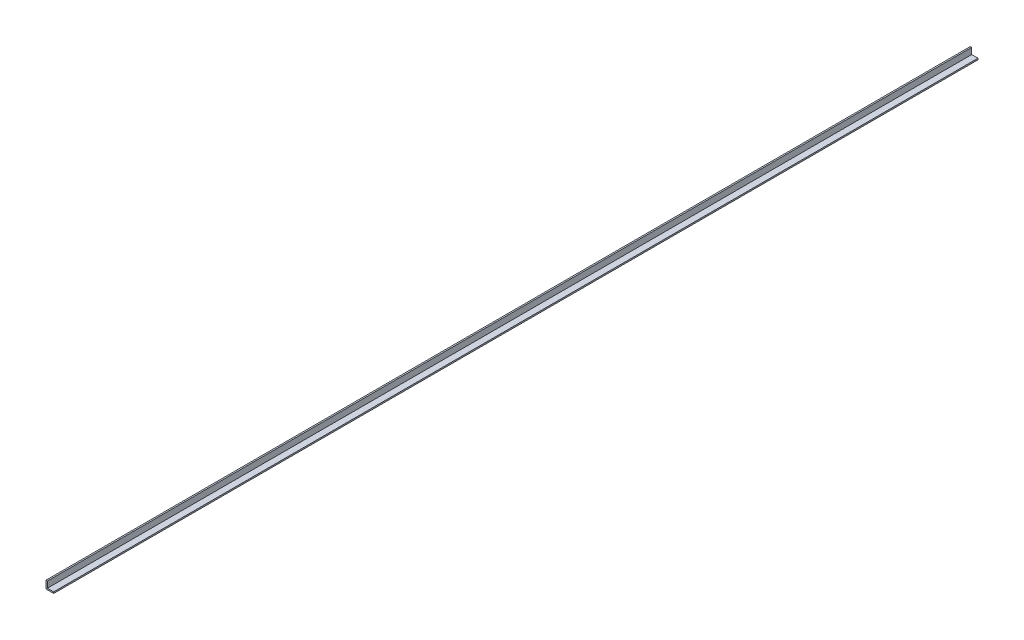
ISO-10303-21;
HEADER;
FILE_DESCRIPTION(('STEP AP214'),'2;1');
FILE_NAME('part.step','',(''),(''),'','','');
FILE_SCHEMA(('AUTOMOTIVE_DESIGN { 1 0 10303 214 1 1 1 1 }'));
ENDSEC;
DATA;
#1=APPLICATION_CONTEXT('core data for automotive mechanical design processes');
#2=APPLICATION_PROTOCOL_DEFINITION('international standard','automotive_design',2000,#1);
#3=PRODUCT_CONTEXT('',#1,'mechanical');
#4=PRODUCT('Part','Part','',(#3));
#5=PRODUCT_RELATED_PRODUCT_CATEGORY('part','',(#4));
#6=PRODUCT_DEFINITION_FORMATION('','',#4);
#7=PRODUCT_DEFINITION_CONTEXT('part definition',#1,'design');
#8=PRODUCT_DEFINITION('design','',#6,#7);
#9=PRODUCT_DEFINITION_SHAPE('','',#8);
#10=(LENGTH_UNIT() NAMED_UNIT(*) SI_UNIT(.MILLI.,.METRE.));
#11=(NAMED_UNIT(*) PLANE_ANGLE_UNIT() SI_UNIT($,.RADIAN.));
#12=(NAMED_UNIT(*) SI_UNIT($,.STERADIAN.) SOLID_ANGLE_UNIT());
#13=UNCERTAINTY_MEASURE_WITH_UNIT(LENGTH_MEASURE(1.E-05),#10,'distance_accuracy_value','');
#14=(GEOMETRIC_REPRESENTATION_CONTEXT(3) GLOBAL_UNCERTAINTY_ASSIGNED_CONTEXT((#13)) GLOBAL_UNIT_ASSIGNED_CONTEXT((#10,
#11,#12)) REPRESENTATION_CONTEXT('',''));
#15=CARTESIAN_POINT('',(0.,0.,0.));
#16=DIRECTION('',(0.,0.,1.));
#17=DIRECTION('',(1.,0.,0.));
#18=AXIS2_PLACEMENT_3D('',#15,#16,#17);
#19=CARTESIAN_POINT('',(9.53000000000001,50.8,-6100.));
#20=DIRECTION('',(0.,1.,0.));
#21=DIRECTION('',(0.,0.,1.));
#22=AXIS2_PLACEMENT_3D('',#19,#20,#21);
#23=PLANE('',#22);
#24=DIRECTION('',(-1.,0.,0.));
#25=VECTOR('',#24,1.);
#26=CARTESIAN_POINT('',(9.53000000000001,50.8,0.));
#27=LINE('',#26,#25);
#28=CARTESIAN_POINT('',(9.53000000000001,50.8,0.));
#29=VERTEX_POINT('',#28);
#30=CARTESIAN_POINT('',(0.,50.8,0.));
#31=VERTEX_POINT('',#30);
#32=EDGE_CURVE('E118',#29,#31,#27,.T.);
#33=ORIENTED_EDGE('',*,*,#32,.F.);
#34=DIRECTION('',(0.,0.,1.));
#35=VECTOR('',#34,1.);
#36=CARTESIAN_POINT('',(9.53000000000001,50.8,-6100.));
#37=LINE('',#36,#35);
#38=CARTESIAN_POINT('',(9.53000000000001,50.8,-6100.));
#39=VERTEX_POINT('',#38);
#40=EDGE_CURVE('E11',#39,#29,#37,.T.);
#41=ORIENTED_EDGE('',*,*,#40,.F.);
#42=DIRECTION('',(-1.,0.,0.));
#43=VECTOR('',#42,1.);
#44=CARTESIAN_POINT('',(9.53000000000001,50.8,-6100.));
#45=LINE('',#44,#43);
#46=CARTESIAN_POINT('',(0.,50.8,-6100.));
#47=VERTEX_POINT('',#46);
#48=EDGE_CURVE('E132',#39,#47,#45,.T.);
#49=ORIENTED_EDGE('',*,*,#48,.T.);
#50=DIRECTION('',(0.,0.,1.));
#51=VECTOR('',#50,1.);
#52=CARTESIAN_POINT('',(0.,50.8,-6100.));
#53=LINE('',#52,#51);
#54=EDGE_CURVE('E36',#47,#31,#53,.T.);
#55=ORIENTED_EDGE('',*,*,#54,.T.);
#56=EDGE_LOOP('',(#33,#41,#49,#55));
#57=FACE_BOUND('',#56,.T.);
#58=ADVANCED_FACE('F33',(#57),#23,.T.);
#59=CARTESIAN_POINT('',(9.53,9.52999999999999,-6100.));
#60=DIRECTION('',(1.,0.,0.));
#61=DIRECTION('',(0.,1.,0.));
#62=AXIS2_PLACEMENT_3D('',#59,#60,#61);
#63=PLANE('',#62);
#64=DIRECTION('',(0.,1.,0.));
#65=VECTOR('',#64,1.);
#66=CARTESIAN_POINT('',(9.53,9.52999999999999,0.));
#67=LINE('',#66,#65);
#68=CARTESIAN_POINT('',(9.53,9.52999999999999,0.));
#69=VERTEX_POINT('',#68);
#70=EDGE_CURVE('E130',#69,#29,#67,.T.);
#71=ORIENTED_EDGE('',*,*,#70,.F.);
#72=DIRECTION('',(0.,0.,1.));
#73=VECTOR('',#72,1.);
#74=CARTESIAN_POINT('',(9.53,9.52999999999999,-6100.));
#75=LINE('',#74,#73);
#76=CARTESIAN_POINT('',(9.53,9.52999999999999,-6100.));
#77=VERTEX_POINT('',#76);
#78=EDGE_CURVE('E42',#77,#69,#75,.T.);
#79=ORIENTED_EDGE('',*,*,#78,.F.);
#80=DIRECTION('',(0.,1.,0.));
#81=VECTOR('',#80,1.);
#82=CARTESIAN_POINT('',(9.53,9.52999999999999,-6100.));
#83=LINE('',#82,#81);
#84=EDGE_CURVE('E108',#77,#39,#83,.T.);
#85=ORIENTED_EDGE('',*,*,#84,.T.);
#86=ORIENTED_EDGE('',*,*,#40,.T.);
#87=EDGE_LOOP('',(#71,#79,#85,#86));
#88=FACE_BOUND('',#87,.T.);
#89=ADVANCED_FACE('F140',(#88),#63,.T.);
#90=CARTESIAN_POINT('',(50.8,9.53,-6100.));
#91=DIRECTION('',(0.,1.,0.));
#92=DIRECTION('',(-1.,0.,0.));
#93=AXIS2_PLACEMENT_3D('',#90,#91,#92);
#94=PLANE('',#93);
#95=DIRECTION('',(-1.,0.,0.));
#96=VECTOR('',#95,1.);
#97=CARTESIAN_POINT('',(50.8,9.53,0.));
#98=LINE('',#97,#96);
#99=CARTESIAN_POINT('',(50.8,9.53,0.));
#100=VERTEX_POINT('',#99);
#101=EDGE_CURVE('E95',#100,#69,#98,.T.);
#102=ORIENTED_EDGE('',*,*,#101,.F.);
#103=DIRECTION('',(0.,0.,1.));
#104=VECTOR('',#103,1.);
#105=CARTESIAN_POINT('',(50.8,9.53,-6100.));
#106=LINE('',#105,#104);
#107=CARTESIAN_POINT('',(50.8,9.53,-6100.));
#108=VERTEX_POINT('',#107);
#109=EDGE_CURVE('E90',#108,#100,#106,.T.);
#110=ORIENTED_EDGE('',*,*,#109,.F.);
#111=DIRECTION('',(-1.,0.,0.));
#112=VECTOR('',#111,1.);
#113=CARTESIAN_POINT('',(50.8,9.53,-6100.));
#114=LINE('',#113,#112);
#115=EDGE_CURVE('E93',#108,#77,#114,.T.);
#116=ORIENTED_EDGE('',*,*,#115,.T.);
#117=ORIENTED_EDGE('',*,*,#78,.T.);
#118=EDGE_LOOP('',(#102,#110,#116,#117));
#119=FACE_BOUND('',#118,.T.);
#120=ADVANCED_FACE('F92',(#119),#94,.T.);
#121=CARTESIAN_POINT('',(50.8,0.,-6100.));
#122=DIRECTION('',(1.,0.,0.));
#123=DIRECTION('',(0.,0.,-1.));
#124=AXIS2_PLACEMENT_3D('',#121,#122,#123);
#125=PLANE('',#124);
#126=DIRECTION('',(0.,1.,0.));
#127=VECTOR('',#126,1.);
#128=CARTESIAN_POINT('',(50.8,0.,0.));
#129=LINE('',#128,#127);
#130=CARTESIAN_POINT('',(50.8,0.,0.));
#131=VERTEX_POINT('',#130);
#132=EDGE_CURVE('E127',#131,#100,#129,.T.);
#133=ORIENTED_EDGE('',*,*,#132,.F.);
#134=DIRECTION('',(0.,0.,1.));
#135=VECTOR('',#134,1.);
#136=CARTESIAN_POINT('',(50.8,0.,-6100.));
#137=LINE('',#136,#135);
#138=CARTESIAN_POINT('',(50.8,0.,-6100.));
#139=VERTEX_POINT('',#138);
#140=EDGE_CURVE('E100',#139,#131,#137,.T.);
#141=ORIENTED_EDGE('',*,*,#140,.F.);
#142=DIRECTION('',(0.,1.,0.));
#143=VECTOR('',#142,1.);
#144=CARTESIAN_POINT('',(50.8,0.,-6100.));
#145=LINE('',#144,#143);
#146=EDGE_CURVE('E106',#139,#108,#145,.T.);
#147=ORIENTED_EDGE('',*,*,#146,.T.);
#148=ORIENTED_EDGE('',*,*,#109,.T.);
#149=EDGE_LOOP('',(#133,#141,#147,#148));
#150=FACE_BOUND('',#149,.T.);
#151=ADVANCED_FACE('F110',(#150),#125,.T.);
#152=CARTESIAN_POINT('',(0.,0.,-6100.));
#153=DIRECTION('',(0.,-1.,0.));
#154=DIRECTION('',(0.,0.,-1.));
#155=AXIS2_PLACEMENT_3D('',#152,#153,#154);
#156=PLANE('',#155);
#157=DIRECTION('',(1.,0.,0.));
#158=VECTOR('',#157,1.);
#159=CARTESIAN_POINT('',(0.,0.,0.));
#160=LINE('',#159,#158);
#161=CARTESIAN_POINT('',(0.,0.,0.));
#162=VERTEX_POINT('',#161);
#163=EDGE_CURVE('E124',#162,#131,#160,.T.);
#164=ORIENTED_EDGE('',*,*,#163,.F.);
#165=DIRECTION('',(0.,0.,1.));
#166=VECTOR('',#165,1.);
#167=CARTESIAN_POINT('',(0.,0.,-6100.));
#168=LINE('',#167,#166);
#169=CARTESIAN_POINT('',(0.,0.,-6100.));
#170=VERTEX_POINT('',#169);
#171=EDGE_CURVE('E135',#170,#162,#168,.T.);
#172=ORIENTED_EDGE('',*,*,#171,.F.);
#173=DIRECTION('',(1.,0.,0.));
#174=VECTOR('',#173,1.);
#175=CARTESIAN_POINT('',(0.,0.,-6100.));
#176=LINE('',#175,#174);
#177=EDGE_CURVE('E111',#170,#139,#176,.T.);
#178=ORIENTED_EDGE('',*,*,#177,.T.);
#179=ORIENTED_EDGE('',*,*,#140,.T.);
#180=EDGE_LOOP('',(#164,#172,#178,#179));
#181=FACE_BOUND('',#180,.T.);
#182=ADVANCED_FACE('F153',(#181),#156,.T.);
#183=CARTESIAN_POINT('',(0.,50.8,-6100.));
#184=DIRECTION('',(-1.,0.,0.));
#185=DIRECTION('',(0.,-1.,0.));
#186=AXIS2_PLACEMENT_3D('',#183,#184,#185);
#187=PLANE('',#186);
#188=DIRECTION('',(0.,-1.,0.));
#189=VECTOR('',#188,1.);
#190=CARTESIAN_POINT('',(0.,50.8,0.));
#191=LINE('',#190,#189);
#192=EDGE_CURVE('E121',#31,#162,#191,.T.);
#193=ORIENTED_EDGE('',*,*,#192,.F.);
#194=ORIENTED_EDGE('',*,*,#54,.F.);
#195=DIRECTION('',(0.,-1.,0.));
#196=VECTOR('',#195,1.);
#197=CARTESIAN_POINT('',(0.,50.8,-6100.));
#198=LINE('',#197,#196);
#199=EDGE_CURVE('E113',#47,#170,#198,.T.);
#200=ORIENTED_EDGE('',*,*,#199,.T.);
#201=ORIENTED_EDGE('',*,*,#171,.T.);
#202=EDGE_LOOP('',(#193,#194,#200,#201));
#203=FACE_BOUND('',#202,.T.);
#204=ADVANCED_FACE('F137',(#203),#187,.T.);
#205=CARTESIAN_POINT('',(0.,0.,-6100.));
#206=DIRECTION('',(0.,0.,1.));
#207=DIRECTION('',(1.,0.,0.));
#208=AXIS2_PLACEMENT_3D('',#205,#206,#207);
#209=PLANE('',#208);
#210=ORIENTED_EDGE('',*,*,#48,.F.);
#211=ORIENTED_EDGE('',*,*,#84,.F.);
#212=ORIENTED_EDGE('',*,*,#115,.F.);
#213=ORIENTED_EDGE('',*,*,#146,.F.);
#214=ORIENTED_EDGE('',*,*,#177,.F.);
#215=ORIENTED_EDGE('',*,*,#199,.F.);
#216=EDGE_LOOP('',(#210,#211,#212,#213,#214,#215));
#217=FACE_BOUND('',#216,.T.);
#218=ADVANCED_FACE('F104',(#217),#209,.F.);
#219=CARTESIAN_POINT('',(0.,0.,0.));
#220=DIRECTION('',(0.,0.,1.));
#221=DIRECTION('',(1.,0.,0.));
#222=AXIS2_PLACEMENT_3D('',#219,#220,#221);
#223=PLANE('',#222);
#224=ORIENTED_EDGE('',*,*,#32,.T.);
#225=ORIENTED_EDGE('',*,*,#192,.T.);
#226=ORIENTED_EDGE('',*,*,#163,.T.);
#227=ORIENTED_EDGE('',*,*,#132,.T.);
#228=ORIENTED_EDGE('',*,*,#101,.T.);
#229=ORIENTED_EDGE('',*,*,#70,.T.);
#230=EDGE_LOOP('',(#224,#225,#226,#227,#228,#229));
#231=FACE_BOUND('',#230,.T.);
#232=ADVANCED_FACE('F139',(#231),#223,.T.);
#233=CLOSED_SHELL('',(#58,#89,#120,#151,#182,#204,#218,#232));
#234=MANIFOLD_SOLID_BREP('B2',#233);
#235=ADVANCED_BREP_SHAPE_REPRESENTATION('',(#18,#234),#14);
#236=SHAPE_DEFINITION_REPRESENTATION(#9,#235);
ENDSEC;
END-ISO-10303-21;
